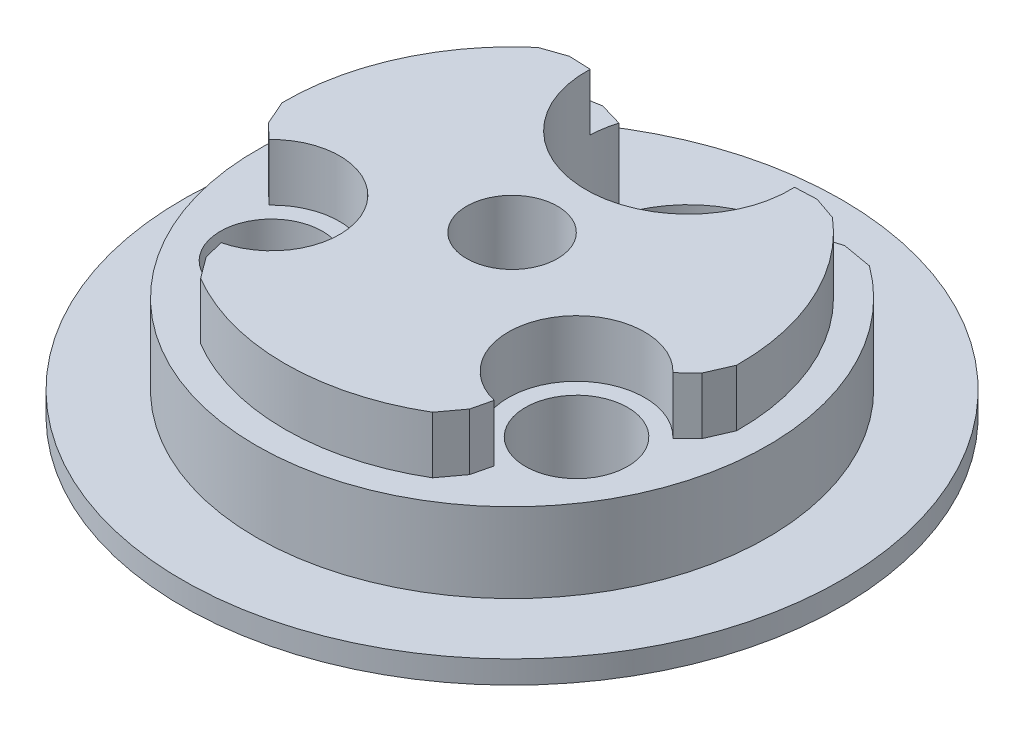
ISO-10303-21;
HEADER;
FILE_DESCRIPTION(('STEP AP214'),'2;1');
FILE_NAME('part.step','',(''),(''),'','','');
FILE_SCHEMA(('AUTOMOTIVE_DESIGN { 1 0 10303 214 1 1 1 1 }'));
ENDSEC;
DATA;
#1=APPLICATION_CONTEXT('core data for automotive mechanical design processes');
#2=APPLICATION_PROTOCOL_DEFINITION('international standard','automotive_design',2000,#1);
#3=PRODUCT_CONTEXT('',#1,'mechanical');
#4=PRODUCT('Part','Part','',(#3));
#5=PRODUCT_RELATED_PRODUCT_CATEGORY('part','',(#4));
#6=PRODUCT_DEFINITION_FORMATION('','',#4);
#7=PRODUCT_DEFINITION_CONTEXT('part definition',#1,'design');
#8=PRODUCT_DEFINITION('design','',#6,#7);
#9=PRODUCT_DEFINITION_SHAPE('','',#8);
#10=(LENGTH_UNIT() NAMED_UNIT(*) SI_UNIT(.MILLI.,.METRE.));
#11=(NAMED_UNIT(*) PLANE_ANGLE_UNIT() SI_UNIT($,.RADIAN.));
#12=(NAMED_UNIT(*) SI_UNIT($,.STERADIAN.) SOLID_ANGLE_UNIT());
#13=UNCERTAINTY_MEASURE_WITH_UNIT(LENGTH_MEASURE(1.E-05),#10,'distance_accuracy_value','');
#14=(GEOMETRIC_REPRESENTATION_CONTEXT(3) GLOBAL_UNCERTAINTY_ASSIGNED_CONTEXT((#13)) GLOBAL_UNIT_ASSIGNED_CONTEXT((#10,
#11,#12)) REPRESENTATION_CONTEXT('',''));
#15=CARTESIAN_POINT('',(0.,0.,0.));
#16=DIRECTION('',(0.,0.,1.));
#17=DIRECTION('',(1.,0.,0.));
#18=AXIS2_PLACEMENT_3D('',#15,#16,#17);
#19=CARTESIAN_POINT('',(0.,0.,0.));
#20=DIRECTION('',(0.,-1.,0.));
#21=DIRECTION('',(0.,0.,-1.));
#22=AXIS2_PLACEMENT_3D('',#19,#20,#21);
#23=PLANE('',#22);
#24=CARTESIAN_POINT('',(0.,0.,0.));
#25=DIRECTION('',(0.,-1.,0.));
#26=DIRECTION('',(0.,0.,-1.));
#27=AXIS2_PLACEMENT_3D('',#24,#25,#26);
#28=CIRCLE('',#27,29.);
#29=CARTESIAN_POINT('',(0.,0.,-29.));
#30=VERTEX_POINT('',#29);
#31=EDGE_CURVE('E273',#30,#30,#28,.T.);
#32=ORIENTED_EDGE('',*,*,#31,.F.);
#33=EDGE_LOOP('',(#32));
#34=FACE_BOUND('',#33,.T.);
#35=CARTESIAN_POINT('',(0.,0.,0.));
#36=DIRECTION('',(0.,1.,0.));
#37=DIRECTION('',(0.,0.,1.));
#38=AXIS2_PLACEMENT_3D('',#35,#36,#37);
#39=CIRCLE('',#38,19.9999999999998);
#40=CARTESIAN_POINT('',(8.64235318321493,0.,-18.0363447365747));
#41=VERTEX_POINT('',#40);
#42=CARTESIAN_POINT('',(8.63404662868261,0.,-18.0403225806449));
#43=VERTEX_POINT('',#42);
#44=EDGE_CURVE('E506',#41,#43,#39,.T.);
#45=ORIENTED_EDGE('',*,*,#44,.F.);
#46=DIRECTION('',(0.95953135461399,0.,-0.281601810208391));
#47=VECTOR('',#46,1.);
#48=CARTESIAN_POINT('',(-4.18818937937064,0.,-14.270856517554));
#49=LINE('',#48,#47);
#50=CARTESIAN_POINT('',(10.6547446660282,0.,-18.6269383442595));
#51=VERTEX_POINT('',#50);
#52=EDGE_CURVE('E248',#41,#51,#49,.T.);
#53=ORIENTED_EDGE('',*,*,#52,.T.);
#54=DIRECTION('',(0.985137296745421,0.,0.171768758978821));
#55=VECTOR('',#54,1.);
#56=CARTESIAN_POINT('',(3.46633546014796,0.,-19.8803109781098));
#57=LINE('',#56,#55);
#58=CARTESIAN_POINT('',(13.2687116499846,0.,-18.1711664774048));
#59=VERTEX_POINT('',#58);
#60=EDGE_CURVE('E63',#51,#59,#57,.T.);
#61=ORIENTED_EDGE('',*,*,#60,.T.);
#62=CARTESIAN_POINT('',(0.,0.,0.));
#63=DIRECTION('',(0.,1.,0.));
#64=DIRECTION('',(0.,0.,1.));
#65=AXIS2_PLACEMENT_3D('',#62,#63,#64);
#66=CIRCLE('',#65,22.5);
#67=CARTESIAN_POINT('',(-13.2687116499827,0.,-18.1711664774063));
#68=VERTEX_POINT('',#67);
#69=EDGE_CURVE('E359',#68,#59,#66,.T.);
#70=ORIENTED_EDGE('',*,*,#69,.F.);
#71=DIRECTION('',(0.985137296745443,0.,-0.171768758978695));
#72=VECTOR('',#71,1.);
#73=CARTESIAN_POINT('',(-3.46633546014538,0.,-19.88031097811));
#74=LINE('',#73,#72);
#75=CARTESIAN_POINT('',(-10.6547446660261,0.,-18.6269383442606));
#76=VERTEX_POINT('',#75);
#77=EDGE_CURVE('E422',#68,#76,#74,.T.);
#78=ORIENTED_EDGE('',*,*,#77,.T.);
#79=DIRECTION('',(-0.959531354613947,0.,-0.281601810208534));
#80=VECTOR('',#79,1.);
#81=CARTESIAN_POINT('',(4.18818937937259,0.,-14.2708565175528));
#82=LINE('',#81,#80);
#83=CARTESIAN_POINT('',(-8.64235318321327,0.,-18.0363447365756));
#84=VERTEX_POINT('',#83);
#85=EDGE_CURVE('E259',#84,#76,#82,.T.);
#86=ORIENTED_EDGE('',*,*,#85,.F.);
#87=CARTESIAN_POINT('',(0.,0.,0.));
#88=DIRECTION('',(0.,1.,0.));
#89=DIRECTION('',(0.,0.,1.));
#90=AXIS2_PLACEMENT_3D('',#87,#88,#89);
#91=CIRCLE('',#90,19.9999999999999);
#92=CARTESIAN_POINT('',(-8.63404662868261,0.,-18.0403225806449));
#93=VERTEX_POINT('',#92);
#94=EDGE_CURVE('E497',#93,#84,#91,.T.);
#95=ORIENTED_EDGE('',*,*,#94,.F.);
#96=CARTESIAN_POINT('',(0.,0.,-15.5));
#97=DIRECTION('',(0.,-1.,0.));
#98=DIRECTION('',(0.,0.,-1.));
#99=AXIS2_PLACEMENT_3D('',#96,#97,#98);
#100=CIRCLE('',#99,9.);
#101=EDGE_CURVE('E268',#93,#43,#100,.T.);
#102=ORIENTED_EDGE('',*,*,#101,.T.);
#103=EDGE_LOOP('',(#45,#53,#61,#70,#78,#86,#95,#102));
#104=FACE_BOUND('',#103,.T.);
#105=ADVANCED_FACE('F40',(#34,#104),#23,.F.);
#106=CARTESIAN_POINT('',(0.,7.,0.));
#107=DIRECTION('',(0.,-1.,0.));
#108=DIRECTION('',(0.,0.,-1.));
#109=AXIS2_PLACEMENT_3D('',#106,#107,#108);
#110=CYLINDRICAL_SURFACE('',#109,22.5);
#111=CARTESIAN_POINT('',(0.,7.,0.));
#112=DIRECTION('',(0.,1.,0.));
#113=DIRECTION('',(0.,0.,1.));
#114=AXIS2_PLACEMENT_3D('',#111,#112,#113);
#115=CIRCLE('',#114,22.5);
#116=CARTESIAN_POINT('',(-13.2687116499827,7.,-18.1711664774063));
#117=VERTEX_POINT('',#116);
#118=CARTESIAN_POINT('',(13.2687116499846,7.,-18.1711664774048));
#119=VERTEX_POINT('',#118);
#120=EDGE_CURVE('E360',#117,#119,#115,.T.);
#121=ORIENTED_EDGE('',*,*,#120,.F.);
#122=DIRECTION('',(0.,-1.,0.));
#123=VECTOR('',#122,1.);
#124=CARTESIAN_POINT('',(-13.2687116499827,7.,-18.1711664774063));
#125=LINE('',#124,#123);
#126=EDGE_CURVE('E401',#117,#68,#125,.T.);
#127=ORIENTED_EDGE('',*,*,#126,.T.);
#128=ORIENTED_EDGE('',*,*,#69,.T.);
#129=DIRECTION('',(0.,-1.,0.));
#130=VECTOR('',#129,1.);
#131=CARTESIAN_POINT('',(13.2687116499846,7.,-18.1711664774048));
#132=LINE('',#131,#130);
#133=EDGE_CURVE('E398',#59,#119,#132,.F.);
#134=ORIENTED_EDGE('',*,*,#133,.T.);
#135=EDGE_LOOP('',(#121,#127,#128,#134));
#136=FACE_BOUND('',#135,.T.);
#137=ADVANCED_FACE('F542',(#136),#110,.T.);
#138=CARTESIAN_POINT('',(0.,7.,0.));
#139=DIRECTION('',(0.,1.,0.));
#140=DIRECTION('',(0.,0.,1.));
#141=AXIS2_PLACEMENT_3D('',#138,#139,#140);
#142=PLANE('',#141);
#143=DIRECTION('',(-0.959531354613947,0.,-0.281601810208534));
#144=VECTOR('',#143,1.);
#145=CARTESIAN_POINT('',(4.18818937937259,7.,-14.2708565175528));
#146=LINE('',#145,#144);
#147=CARTESIAN_POINT('',(-8.64235318321327,7.,-18.0363447365756));
#148=VERTEX_POINT('',#147);
#149=CARTESIAN_POINT('',(-10.6547446660261,7.,-18.6269383442606));
#150=VERTEX_POINT('',#149);
#151=EDGE_CURVE('E247',#148,#150,#146,.T.);
#152=ORIENTED_EDGE('',*,*,#151,.T.);
#153=DIRECTION('',(-0.985137296745443,0.,0.171768758978695));
#154=VECTOR('',#153,1.);
#155=CARTESIAN_POINT('',(-3.46633546014538,7.,-19.88031097811));
#156=LINE('',#155,#154);
#157=EDGE_CURVE('E396',#150,#117,#156,.T.);
#158=ORIENTED_EDGE('',*,*,#157,.T.);
#159=ORIENTED_EDGE('',*,*,#120,.T.);
#160=DIRECTION('',(-0.985137296745421,0.,-0.171768758978821));
#161=VECTOR('',#160,1.);
#162=CARTESIAN_POINT('',(3.46633546014796,7.,-19.8803109781098));
#163=LINE('',#162,#161);
#164=CARTESIAN_POINT('',(10.6547446660282,7.,-18.6269383442595));
#165=VERTEX_POINT('',#164);
#166=EDGE_CURVE('E394',#119,#165,#163,.T.);
#167=ORIENTED_EDGE('',*,*,#166,.T.);
#168=DIRECTION('',(0.95953135461399,0.,-0.281601810208391));
#169=VECTOR('',#168,1.);
#170=CARTESIAN_POINT('',(-4.18818937937064,7.,-14.270856517554));
#171=LINE('',#170,#169);
#172=CARTESIAN_POINT('',(8.64235318321488,7.,-18.0363447365747));
#173=VERTEX_POINT('',#172);
#174=EDGE_CURVE('E250',#173,#165,#171,.T.);
#175=ORIENTED_EDGE('',*,*,#174,.F.);
#176=CARTESIAN_POINT('',(0.,7.,0.));
#177=DIRECTION('',(0.,1.,0.));
#178=DIRECTION('',(0.,0.,1.));
#179=AXIS2_PLACEMENT_3D('',#176,#177,#178);
#180=CIRCLE('',#179,19.9999999999998);
#181=CARTESIAN_POINT('',(8.63404662868261,7.,-18.0403225806449));
#182=VERTEX_POINT('',#181);
#183=EDGE_CURVE('E224',#173,#182,#180,.T.);
#184=ORIENTED_EDGE('',*,*,#183,.T.);
#185=CARTESIAN_POINT('',(0.,7.,-15.5));
#186=DIRECTION('',(0.,1.,0.));
#187=DIRECTION('',(0.,0.,1.));
#188=AXIS2_PLACEMENT_3D('',#185,#186,#187);
#189=CIRCLE('',#188,9.);
#190=CARTESIAN_POINT('',(8.99249171354196,7.,-15.8675496998764));
#191=VERTEX_POINT('',#190);
#192=EDGE_CURVE('E216',#182,#191,#189,.F.);
#193=ORIENTED_EDGE('',*,*,#192,.T.);
#194=DIRECTION('',(0.999165745949107,0.,-0.0408388555418192));
#195=VECTOR('',#194,1.);
#196=CARTESIAN_POINT('',(8.99249171354196,7.,-15.8675496998764));
#197=LINE('',#196,#195);
#198=CARTESIAN_POINT('',(10.8936338094093,7.,-15.9452549932497));
#199=VERTEX_POINT('',#198);
#200=EDGE_CURVE('E221',#191,#199,#197,.T.);
#201=ORIENTED_EDGE('',*,*,#200,.T.);
#202=DIRECTION('',(-0.945373300215917,0.,-0.325989759407969));
#203=VECTOR('',#202,1.);
#204=CARTESIAN_POINT('',(12.9601769129819,7.,-15.2326561828264));
#205=LINE('',#204,#203);
#206=CARTESIAN_POINT('',(12.9601769129819,7.,-15.2326561828264));
#207=VERTEX_POINT('',#206);
#208=EDGE_CURVE('E425',#199,#207,#205,.F.);
#209=ORIENTED_EDGE('',*,*,#208,.T.);
#210=CARTESIAN_POINT('',(0.,7.,0.));
#211=DIRECTION('',(0.,1.,0.));
#212=DIRECTION('',(0.,0.,1.));
#213=AXIS2_PLACEMENT_3D('',#210,#211,#212);
#214=CIRCLE('',#213,19.9999999999997);
#215=CARTESIAN_POINT('',(19.9985938654754,7.,0.237156918005799));
#216=VERTEX_POINT('',#215);
#217=EDGE_CURVE('E350',#216,#207,#214,.T.);
#218=ORIENTED_EDGE('',*,*,#217,.F.);
#219=DIRECTION('',(0.399344716269985,0.,-0.91680084946909));
#220=VECTOR('',#219,1.);
#221=CARTESIAN_POINT('',(19.0678522615133,7.,2.37391911463342));
#222=LINE('',#221,#220);
#223=CARTESIAN_POINT('',(19.0678522615133,7.,2.37391911463342));
#224=VERTEX_POINT('',#223);
#225=EDGE_CURVE('E418',#216,#224,#222,.F.);
#226=ORIENTED_EDGE('',*,*,#225,.T.);
#227=DIRECTION('',(0.724111911442842,0.,-0.689682491953068));
#228=VECTOR('',#227,1.);
#229=CARTESIAN_POINT('',(10.2554041460994,7.,10.7673609022921));
#230=LINE('',#229,#228);
#231=CARTESIAN_POINT('',(17.7680652273165,7.,3.61190504828133));
#232=VERTEX_POINT('',#231);
#233=EDGE_CURVE('E319',#232,#224,#230,.T.);
#234=ORIENTED_EDGE('',*,*,#233,.F.);
#235=CARTESIAN_POINT('',(13.4233937586587,7.,7.74999999999898));
#236=DIRECTION('',(0.,1.,0.));
#237=DIRECTION('',(0.,0.,1.));
#238=AXIS2_PLACEMENT_3D('',#235,#236,#237);
#239=CIRCLE('',#238,6.);
#240=CARTESIAN_POINT('',(12.012034141529,7.,13.5816433388131));
#241=VERTEX_POINT('',#240);
#242=EDGE_CURVE('E306',#232,#241,#239,.T.);
#243=ORIENTED_EDGE('',*,*,#242,.T.);
#244=DIRECTION('',(0.23522660285514,0.,-0.97194055646898));
#245=VECTOR('',#244,1.);
#246=CARTESIAN_POINT('',(14.4525101461505,7.,3.49776006544996));
#247=LINE('',#246,#245);
#248=CARTESIAN_POINT('',(11.5898003905609,7.,15.3262848967609));
#249=VERTEX_POINT('',#248);
#250=EDGE_CURVE('E317',#249,#241,#247,.T.);
#251=ORIENTED_EDGE('',*,*,#250,.F.);
#252=DIRECTION('',(0.594300467716276,0.,-0.804243093891527));
#253=VECTOR('',#252,1.);
#254=CARTESIAN_POINT('',(10.2046808484164,7.,17.2007118684652));
#255=LINE('',#254,#253);
#256=CARTESIAN_POINT('',(10.2046808484164,7.,17.2007118684652));
#257=VERTEX_POINT('',#256);
#258=EDGE_CURVE('E420',#249,#257,#255,.F.);
#259=ORIENTED_EDGE('',*,*,#258,.T.);
#260=CARTESIAN_POINT('',(0.,7.,0.));
#261=DIRECTION('',(0.,1.,0.));
#262=DIRECTION('',(0.,0.,1.));
#263=AXIS2_PLACEMENT_3D('',#260,#261,#262);
#264=CIRCLE('',#263,19.9999999999999);
#265=CARTESIAN_POINT('',(-10.2046808484139,7.,17.2007118684667));
#266=VERTEX_POINT('',#265);
#267=EDGE_CURVE('E356',#266,#257,#264,.T.);
#268=ORIENTED_EDGE('',*,*,#267,.F.);
#269=DIRECTION('',(0.59430046771634,0.,0.80424309389148));
#270=VECTOR('',#269,1.);
#271=CARTESIAN_POINT('',(-11.5898003905587,7.,15.3262848967622));
#272=LINE('',#271,#270);
#273=CARTESIAN_POINT('',(-11.5898003905587,7.,15.3262848967622));
#274=VERTEX_POINT('',#273);
#275=EDGE_CURVE('E13',#266,#274,#272,.F.);
#276=ORIENTED_EDGE('',*,*,#275,.T.);
#277=DIRECTION('',(0.235226602855154,0.,0.971940556468977));
#278=VECTOR('',#277,1.);
#279=CARTESIAN_POINT('',(-14.4525101461489,7.,3.4977600654498));
#280=LINE('',#279,#278);
#281=CARTESIAN_POINT('',(-12.0120341415269,7.,13.5816433388144));
#282=VERTEX_POINT('',#281);
#283=EDGE_CURVE('E327',#282,#274,#280,.T.);
#284=ORIENTED_EDGE('',*,*,#283,.F.);
#285=CARTESIAN_POINT('',(-13.4233937586578,7.,7.75000000000058));
#286=DIRECTION('',(0.,1.,0.));
#287=DIRECTION('',(0.,0.,1.));
#288=AXIS2_PLACEMENT_3D('',#285,#286,#287);
#289=CIRCLE('',#288,6.);
#290=CARTESIAN_POINT('',(-17.768065227316,7.,3.61190504828334));
#291=VERTEX_POINT('',#290);
#292=EDGE_CURVE('E293',#282,#291,#289,.T.);
#293=ORIENTED_EDGE('',*,*,#292,.T.);
#294=DIRECTION('',(0.724111911443029,0.,0.689682491952872));
#295=VECTOR('',#294,1.);
#296=CARTESIAN_POINT('',(-10.2554041460953,7.,10.7673609022937));
#297=LINE('',#296,#295);
#298=CARTESIAN_POINT('',(-19.0678522615129,7.,2.37391911463603));
#299=VERTEX_POINT('',#298);
#300=EDGE_CURVE('E325',#299,#291,#297,.T.);
#301=ORIENTED_EDGE('',*,*,#300,.F.);
#302=DIRECTION('',(0.399344716270161,0.,0.916800849469013));
#303=VECTOR('',#302,1.);
#304=CARTESIAN_POINT('',(-19.9985938654756,7.,0.237156918008205));
#305=LINE('',#304,#303);
#306=CARTESIAN_POINT('',(-19.9985938654756,7.,0.237156918008197));
#307=VERTEX_POINT('',#306);
#308=EDGE_CURVE('E49',#299,#307,#305,.F.);
#309=ORIENTED_EDGE('',*,*,#308,.T.);
#310=CARTESIAN_POINT('',(0.,7.,0.));
#311=DIRECTION('',(0.,1.,0.));
#312=DIRECTION('',(0.,0.,1.));
#313=AXIS2_PLACEMENT_3D('',#310,#311,#312);
#314=CIRCLE('',#313,19.9999999999999);
#315=CARTESIAN_POINT('',(-12.96017691298,7.,-15.2326561828283));
#316=VERTEX_POINT('',#315);
#317=EDGE_CURVE('E353',#316,#307,#314,.T.);
#318=ORIENTED_EDGE('',*,*,#317,.F.);
#319=DIRECTION('',(-0.945373300215965,0.,0.32598975940783));
#320=VECTOR('',#319,1.);
#321=CARTESIAN_POINT('',(-10.8936338094071,7.,-15.9452549932514));
#322=LINE('',#321,#320);
#323=CARTESIAN_POINT('',(-10.8936338094071,7.,-15.9452549932514));
#324=VERTEX_POINT('',#323);
#325=EDGE_CURVE('E427',#316,#324,#322,.F.);
#326=ORIENTED_EDGE('',*,*,#325,.T.);
#327=DIRECTION('',(0.9991657459491,0.,0.0408388555419765));
#328=VECTOR('',#327,1.);
#329=CARTESIAN_POINT('',(-12.0120341415269,7.,-15.9909673185454));
#330=LINE('',#329,#328);
#331=CARTESIAN_POINT('',(-8.9924917135419,7.,-15.8675496998778));
#332=VERTEX_POINT('',#331);
#333=EDGE_CURVE('E262',#324,#332,#330,.T.);
#334=ORIENTED_EDGE('',*,*,#333,.T.);
#335=CARTESIAN_POINT('',(0.,7.,-15.5));
#336=DIRECTION('',(0.,1.,0.));
#337=DIRECTION('',(0.,0.,1.));
#338=AXIS2_PLACEMENT_3D('',#335,#336,#337);
#339=CIRCLE('',#338,9.);
#340=CARTESIAN_POINT('',(-8.63404662868261,7.,-18.0403225806449));
#341=VERTEX_POINT('',#340);
#342=EDGE_CURVE('E498',#332,#341,#339,.F.);
#343=ORIENTED_EDGE('',*,*,#342,.T.);
#344=CARTESIAN_POINT('',(0.,7.,0.));
#345=DIRECTION('',(0.,1.,0.));
#346=DIRECTION('',(0.,0.,1.));
#347=AXIS2_PLACEMENT_3D('',#344,#345,#346);
#348=CIRCLE('',#347,19.9999999999999);
#349=EDGE_CURVE('E501',#341,#148,#348,.T.);
#350=ORIENTED_EDGE('',*,*,#349,.T.);
#351=EDGE_LOOP('',(#152,#158,#159,#167,#175,#184,#193,#201,#209,#218,#226,#234,#243,#251,#259,
#268,#276,#284,#293,#301,#309,#318,#326,#334,#343,#350));
#352=FACE_BOUND('',#351,.T.);
#353=CARTESIAN_POINT('',(-13.4233937586578,7.,7.75000000000058));
#354=DIRECTION('',(0.,-1.,0.));
#355=DIRECTION('',(0.,0.,-1.));
#356=AXIS2_PLACEMENT_3D('',#353,#354,#355);
#357=CIRCLE('',#356,4.49999999999959);
#358=CARTESIAN_POINT('',(-13.4233937586578,7.,3.25000000000099));
#359=VERTEX_POINT('',#358);
#360=EDGE_CURVE('E322',#359,#359,#357,.T.);
#361=ORIENTED_EDGE('',*,*,#360,.T.);
#362=EDGE_LOOP('',(#361));
#363=FACE_BOUND('',#362,.T.);
#364=CARTESIAN_POINT('',(13.4233937586598,7.,7.74999999999944));
#365=DIRECTION('',(0.,-1.,0.));
#366=DIRECTION('',(0.,0.,-1.));
#367=AXIS2_PLACEMENT_3D('',#364,#365,#366);
#368=CIRCLE('',#367,4.49999999999885);
#369=CARTESIAN_POINT('',(13.4233937586598,7.,3.25000000000058));
#370=VERTEX_POINT('',#369);
#371=EDGE_CURVE('E304',#370,#370,#368,.T.);
#372=ORIENTED_EDGE('',*,*,#371,.T.);
#373=EDGE_LOOP('',(#372));
#374=FACE_BOUND('',#373,.T.);
#375=ADVANCED_FACE('F219',(#352,#363,#374),#142,.T.);
#376=CARTESIAN_POINT('',(13.4233937586587,0.,7.74999999999898));
#377=DIRECTION('',(0.,1.,0.));
#378=DIRECTION('',(0.,0.,1.));
#379=AXIS2_PLACEMENT_3D('',#376,#377,#378);
#380=CYLINDRICAL_SURFACE('',#379,4.5);
#381=ORIENTED_EDGE('',*,*,#371,.F.);
#382=EDGE_LOOP('',(#381));
#383=FACE_BOUND('',#382,.T.);
#384=CARTESIAN_POINT('',(13.4233937586587,-2.,7.74999999999898));
#385=DIRECTION('',(0.,-1.,0.));
#386=DIRECTION('',(0.,0.,-1.));
#387=AXIS2_PLACEMENT_3D('',#384,#385,#386);
#388=CIRCLE('',#387,4.5);
#389=CARTESIAN_POINT('',(13.4233937586587,-2.,3.24999999999898));
#390=VERTEX_POINT('',#389);
#391=EDGE_CURVE('E279',#390,#390,#388,.F.);
#392=ORIENTED_EDGE('',*,*,#391,.F.);
#393=EDGE_LOOP('',(#392));
#394=FACE_BOUND('',#393,.T.);
#395=ADVANCED_FACE('F569',(#383,#394),#380,.F.);
#396=CARTESIAN_POINT('',(-13.4233937586578,0.,7.75000000000058));
#397=DIRECTION('',(0.,1.,0.));
#398=DIRECTION('',(0.,0.,1.));
#399=AXIS2_PLACEMENT_3D('',#396,#397,#398);
#400=CYLINDRICAL_SURFACE('',#399,4.5);
#401=ORIENTED_EDGE('',*,*,#360,.F.);
#402=EDGE_LOOP('',(#401));
#403=FACE_BOUND('',#402,.T.);
#404=CARTESIAN_POINT('',(-13.4233937586578,-2.,7.75000000000058));
#405=DIRECTION('',(0.,-1.,0.));
#406=DIRECTION('',(0.,0.,-1.));
#407=AXIS2_PLACEMENT_3D('',#404,#405,#406);
#408=CIRCLE('',#407,4.5);
#409=CARTESIAN_POINT('',(-13.4233937586578,-2.,3.25000000000058));
#410=VERTEX_POINT('',#409);
#411=EDGE_CURVE('E276',#410,#410,#408,.F.);
#412=ORIENTED_EDGE('',*,*,#411,.F.);
#413=EDGE_LOOP('',(#412));
#414=FACE_BOUND('',#413,.T.);
#415=ADVANCED_FACE('F572',(#403,#414),#400,.F.);
#416=CARTESIAN_POINT('',(10.2554041460994,0.,10.7673609022921));
#417=DIRECTION('',(0.689682491953068,0.,0.724111911442842));
#418=DIRECTION('',(0.724111911442842,0.,-0.689682491953068));
#419=AXIS2_PLACEMENT_3D('',#416,#417,#418);
#420=PLANE('',#419);
#421=ORIENTED_EDGE('',*,*,#233,.T.);
#422=DIRECTION('',(0.,1.,0.));
#423=VECTOR('',#422,1.);
#424=CARTESIAN_POINT('',(19.0678522615133,0.,2.37391911463342));
#425=LINE('',#424,#423);
#426=CARTESIAN_POINT('',(19.0678522615133,12.,2.37391911463342));
#427=VERTEX_POINT('',#426);
#428=EDGE_CURVE('E363',#224,#427,#425,.T.);
#429=ORIENTED_EDGE('',*,*,#428,.T.);
#430=DIRECTION('',(0.724111911442842,0.,-0.689682491953068));
#431=VECTOR('',#430,1.);
#432=CARTESIAN_POINT('',(10.2554041460994,12.,10.7673609022921));
#433=LINE('',#432,#431);
#434=CARTESIAN_POINT('',(17.7680652273165,12.,3.61190504828133));
#435=VERTEX_POINT('',#434);
#436=EDGE_CURVE('E330',#435,#427,#433,.T.);
#437=ORIENTED_EDGE('',*,*,#436,.F.);
#438=DIRECTION('',(0.,1.,0.));
#439=VECTOR('',#438,1.);
#440=CARTESIAN_POINT('',(17.7680652273165,7.,3.61190504828133));
#441=LINE('',#440,#439);
#442=EDGE_CURVE('E309',#232,#435,#441,.T.);
#443=ORIENTED_EDGE('',*,*,#442,.F.);
#444=EDGE_LOOP('',(#421,#429,#437,#443));
#445=FACE_BOUND('',#444,.T.);
#446=ADVANCED_FACE('F482',(#445),#420,.T.);
#447=CARTESIAN_POINT('',(14.4525101461505,0.,3.49776006544996));
#448=DIRECTION('',(0.97194055646898,0.,0.23522660285514));
#449=DIRECTION('',(0.23522660285514,0.,-0.97194055646898));
#450=AXIS2_PLACEMENT_3D('',#447,#448,#449);
#451=PLANE('',#450);
#452=DIRECTION('',(0.23522660285514,0.,-0.97194055646898));
#453=VECTOR('',#452,1.);
#454=CARTESIAN_POINT('',(14.4525101461505,12.,3.49776006544996));
#455=LINE('',#454,#453);
#456=CARTESIAN_POINT('',(11.5898003905609,12.,15.3262848967609));
#457=VERTEX_POINT('',#456);
#458=CARTESIAN_POINT('',(12.012034141529,12.,13.5816433388131));
#459=VERTEX_POINT('',#458);
#460=EDGE_CURVE('E348',#457,#459,#455,.T.);
#461=ORIENTED_EDGE('',*,*,#460,.F.);
#462=DIRECTION('',(0.,-1.,0.));
#463=VECTOR('',#462,1.);
#464=CARTESIAN_POINT('',(11.5898003905609,0.,15.3262848967609));
#465=LINE('',#464,#463);
#466=EDGE_CURVE('E389',#457,#249,#465,.T.);
#467=ORIENTED_EDGE('',*,*,#466,.T.);
#468=ORIENTED_EDGE('',*,*,#250,.T.);
#469=DIRECTION('',(0.,1.,0.));
#470=VECTOR('',#469,1.);
#471=CARTESIAN_POINT('',(12.012034141529,7.,13.5816433388131));
#472=LINE('',#471,#470);
#473=EDGE_CURVE('E300',#241,#459,#472,.T.);
#474=ORIENTED_EDGE('',*,*,#473,.T.);
#475=EDGE_LOOP('',(#461,#467,#468,#474));
#476=FACE_BOUND('',#475,.T.);
#477=ADVANCED_FACE('F471',(#476),#451,.T.);
#478=CARTESIAN_POINT('',(-14.4525101461489,0.,3.4977600654498));
#479=DIRECTION('',(-0.971940556468976,0.,0.235226602855154));
#480=DIRECTION('',(0.235226602855154,0.,0.971940556468977));
#481=AXIS2_PLACEMENT_3D('',#478,#479,#480);
#482=PLANE('',#481);
#483=ORIENTED_EDGE('',*,*,#283,.T.);
#484=DIRECTION('',(0.,1.,0.));
#485=VECTOR('',#484,1.);
#486=CARTESIAN_POINT('',(-11.5898003905587,0.,15.3262848967622));
#487=LINE('',#486,#485);
#488=CARTESIAN_POINT('',(-11.5898003905587,12.,15.3262848967622));
#489=VERTEX_POINT('',#488);
#490=EDGE_CURVE('E415',#274,#489,#487,.T.);
#491=ORIENTED_EDGE('',*,*,#490,.T.);
#492=DIRECTION('',(0.235226602855154,0.,0.971940556468977));
#493=VECTOR('',#492,1.);
#494=CARTESIAN_POINT('',(-14.4525101461489,12.,3.4977600654498));
#495=LINE('',#494,#493);
#496=CARTESIAN_POINT('',(-12.0120341415269,12.,13.5816433388144));
#497=VERTEX_POINT('',#496);
#498=EDGE_CURVE('E342',#497,#489,#495,.T.);
#499=ORIENTED_EDGE('',*,*,#498,.F.);
#500=DIRECTION('',(0.,1.,0.));
#501=VECTOR('',#500,1.);
#502=CARTESIAN_POINT('',(-12.0120341415269,7.,13.5816433388144));
#503=LINE('',#502,#501);
#504=EDGE_CURVE('E296',#282,#497,#503,.T.);
#505=ORIENTED_EDGE('',*,*,#504,.F.);
#506=EDGE_LOOP('',(#483,#491,#499,#505));
#507=FACE_BOUND('',#506,.T.);
#508=ADVANCED_FACE('F456',(#507),#482,.T.);
#509=CARTESIAN_POINT('',(-10.2554041460953,0.,10.7673609022937));
#510=DIRECTION('',(-0.689682491952872,0.,0.724111911443029));
#511=DIRECTION('',(0.724111911443029,0.,0.689682491952872));
#512=AXIS2_PLACEMENT_3D('',#509,#510,#511);
#513=PLANE('',#512);
#514=DIRECTION('',(0.724111911443029,0.,0.689682491952872));
#515=VECTOR('',#514,1.);
#516=CARTESIAN_POINT('',(-10.2554041460953,12.,10.7673609022937));
#517=LINE('',#516,#515);
#518=CARTESIAN_POINT('',(-19.0678522615129,12.,2.37391911463603));
#519=VERTEX_POINT('',#518);
#520=CARTESIAN_POINT('',(-17.768065227316,12.,3.61190504828334));
#521=VERTEX_POINT('',#520);
#522=EDGE_CURVE('E340',#519,#521,#517,.T.);
#523=ORIENTED_EDGE('',*,*,#522,.F.);
#524=DIRECTION('',(0.,-1.,0.));
#525=VECTOR('',#524,1.);
#526=CARTESIAN_POINT('',(-19.0678522615129,0.,2.37391911463603));
#527=LINE('',#526,#525);
#528=EDGE_CURVE('E413',#519,#299,#527,.T.);
#529=ORIENTED_EDGE('',*,*,#528,.T.);
#530=ORIENTED_EDGE('',*,*,#300,.T.);
#531=DIRECTION('',(0.,1.,0.));
#532=VECTOR('',#531,1.);
#533=CARTESIAN_POINT('',(-17.768065227316,7.,3.61190504828334));
#534=LINE('',#533,#532);
#535=EDGE_CURVE('E301',#291,#521,#534,.T.);
#536=ORIENTED_EDGE('',*,*,#535,.T.);
#537=EDGE_LOOP('',(#523,#529,#530,#536));
#538=FACE_BOUND('',#537,.T.);
#539=ADVANCED_FACE('F446',(#538),#513,.T.);
#540=CARTESIAN_POINT('',(0.,7.,-15.5));
#541=DIRECTION('',(0.,-1.,0.));
#542=DIRECTION('',(0.,0.,-1.));
#543=AXIS2_PLACEMENT_3D('',#540,#541,#542);
#544=CYLINDRICAL_SURFACE('',#543,9.);
#545=ORIENTED_EDGE('',*,*,#101,.F.);
#546=DIRECTION('',(0.,-1.,0.));
#547=VECTOR('',#546,1.);
#548=CARTESIAN_POINT('',(-8.63404662868261,11.0164339442283,-18.0403225806449));
#549=LINE('',#548,#547);
#550=EDGE_CURVE('E229',#341,#93,#549,.T.);
#551=ORIENTED_EDGE('',*,*,#550,.F.);
#552=ORIENTED_EDGE('',*,*,#342,.F.);
#553=DIRECTION('',(0.,1.,0.));
#554=VECTOR('',#553,1.);
#555=CARTESIAN_POINT('',(-8.9924917135419,-7.69343938724481,-15.8675496998778));
#556=LINE('',#555,#554);
#557=CARTESIAN_POINT('',(-8.9924917135419,12.,-15.8675496998778));
#558=VERTEX_POINT('',#557);
#559=EDGE_CURVE('E263',#332,#558,#556,.T.);
#560=ORIENTED_EDGE('',*,*,#559,.T.);
#561=CARTESIAN_POINT('',(0.,12.,-15.5));
#562=DIRECTION('',(0.,1.,0.));
#563=DIRECTION('',(0.,0.,1.));
#564=AXIS2_PLACEMENT_3D('',#561,#562,#563);
#565=CIRCLE('',#564,9.);
#566=CARTESIAN_POINT('',(8.99249171354196,12.,-15.8675496998764));
#567=VERTEX_POINT('',#566);
#568=EDGE_CURVE('E246',#567,#558,#565,.F.);
#569=ORIENTED_EDGE('',*,*,#568,.F.);
#570=DIRECTION('',(0.,1.,0.));
#571=VECTOR('',#570,1.);
#572=CARTESIAN_POINT('',(8.99249171354196,-7.69343938724481,-15.8675496998764));
#573=LINE('',#572,#571);
#574=EDGE_CURVE('E234',#191,#567,#573,.T.);
#575=ORIENTED_EDGE('',*,*,#574,.F.);
#576=ORIENTED_EDGE('',*,*,#192,.F.);
#577=DIRECTION('',(0.,-1.,0.));
#578=VECTOR('',#577,1.);
#579=CARTESIAN_POINT('',(8.63404662868261,11.0164339442283,-18.0403225806449));
#580=LINE('',#579,#578);
#581=EDGE_CURVE('E238',#182,#43,#580,.T.);
#582=ORIENTED_EDGE('',*,*,#581,.T.);
#583=EDGE_LOOP('',(#545,#551,#552,#560,#569,#575,#576,#582));
#584=FACE_BOUND('',#583,.T.);
#585=CARTESIAN_POINT('',(0.,-2.,-15.5));
#586=DIRECTION('',(0.,-1.,0.));
#587=DIRECTION('',(0.,0.,-1.));
#588=AXIS2_PLACEMENT_3D('',#585,#586,#587);
#589=CIRCLE('',#588,9.);
#590=CARTESIAN_POINT('',(0.,-2.,-24.5));
#591=VERTEX_POINT('',#590);
#592=EDGE_CURVE('E269',#591,#591,#589,.T.);
#593=ORIENTED_EDGE('',*,*,#592,.T.);
#594=EDGE_LOOP('',(#593));
#595=FACE_BOUND('',#594,.T.);
#596=ADVANCED_FACE('F242',(#584,#595),#544,.F.);
#597=CARTESIAN_POINT('',(0.,0.,0.));
#598=DIRECTION('',(0.,1.,0.));
#599=DIRECTION('',(0.,0.,1.));
#600=AXIS2_PLACEMENT_3D('',#597,#598,#599);
#601=CYLINDRICAL_SURFACE('',#600,19.9999999999999);
#602=ORIENTED_EDGE('',*,*,#267,.T.);
#603=DIRECTION('',(0.,1.,0.));
#604=VECTOR('',#603,1.);
#605=CARTESIAN_POINT('',(10.2046808484164,0.,17.2007118684652));
#606=LINE('',#605,#604);
#607=CARTESIAN_POINT('',(10.2046808484164,12.,17.2007118684652));
#608=VERTEX_POINT('',#607);
#609=EDGE_CURVE('E386',#257,#608,#606,.T.);
#610=ORIENTED_EDGE('',*,*,#609,.T.);
#611=CARTESIAN_POINT('',(0.,12.,0.));
#612=DIRECTION('',(0.,1.,0.));
#613=DIRECTION('',(0.,0.,1.));
#614=AXIS2_PLACEMENT_3D('',#611,#612,#613);
#615=CIRCLE('',#614,19.9999999999999);
#616=CARTESIAN_POINT('',(-10.2046808484139,12.,17.2007118684667));
#617=VERTEX_POINT('',#616);
#618=EDGE_CURVE('E345',#617,#608,#615,.T.);
#619=ORIENTED_EDGE('',*,*,#618,.F.);
#620=DIRECTION('',(0.,1.,0.));
#621=VECTOR('',#620,1.);
#622=CARTESIAN_POINT('',(-10.2046808484139,0.,17.2007118684667));
#623=LINE('',#622,#621);
#624=EDGE_CURVE('E384',#617,#266,#623,.F.);
#625=ORIENTED_EDGE('',*,*,#624,.T.);
#626=EDGE_LOOP('',(#602,#610,#619,#625));
#627=FACE_BOUND('',#626,.T.);
#628=ADVANCED_FACE('F462',(#627),#601,.T.);
#629=CARTESIAN_POINT('',(0.,0.,0.));
#630=DIRECTION('',(0.,1.,0.));
#631=DIRECTION('',(0.,0.,1.));
#632=AXIS2_PLACEMENT_3D('',#629,#630,#631);
#633=CYLINDRICAL_SURFACE('',#632,19.9999999999999);
#634=CARTESIAN_POINT('',(0.,12.,0.));
#635=DIRECTION('',(0.,1.,0.));
#636=DIRECTION('',(0.,0.,1.));
#637=AXIS2_PLACEMENT_3D('',#634,#635,#636);
#638=CIRCLE('',#637,19.9999999999999);
#639=CARTESIAN_POINT('',(-12.96017691298,12.,-15.2326561828283));
#640=VERTEX_POINT('',#639);
#641=CARTESIAN_POINT('',(-19.9985938654756,12.,0.237156918008197));
#642=VERTEX_POINT('',#641);
#643=EDGE_CURVE('E337',#640,#642,#638,.T.);
#644=ORIENTED_EDGE('',*,*,#643,.F.);
#645=DIRECTION('',(0.,1.,0.));
#646=VECTOR('',#645,1.);
#647=CARTESIAN_POINT('',(-12.96017691298,0.,-15.2326561828283));
#648=LINE('',#647,#646);
#649=EDGE_CURVE('E411',#640,#316,#648,.F.);
#650=ORIENTED_EDGE('',*,*,#649,.T.);
#651=ORIENTED_EDGE('',*,*,#317,.T.);
#652=DIRECTION('',(0.,1.,0.));
#653=VECTOR('',#652,1.);
#654=CARTESIAN_POINT('',(-19.9985938654756,0.,0.237156918008197));
#655=LINE('',#654,#653);
#656=EDGE_CURVE('E408',#307,#642,#655,.T.);
#657=ORIENTED_EDGE('',*,*,#656,.T.);
#658=EDGE_LOOP('',(#644,#650,#651,#657));
#659=FACE_BOUND('',#658,.T.);
#660=ADVANCED_FACE('F437',(#659),#633,.T.);
#661=CARTESIAN_POINT('',(0.,0.,0.));
#662=DIRECTION('',(0.,1.,0.));
#663=DIRECTION('',(0.,0.,1.));
#664=AXIS2_PLACEMENT_3D('',#661,#662,#663);
#665=CYLINDRICAL_SURFACE('',#664,19.9999999999997);
#666=CARTESIAN_POINT('',(0.,12.,0.));
#667=DIRECTION('',(0.,1.,0.));
#668=DIRECTION('',(0.,0.,1.));
#669=AXIS2_PLACEMENT_3D('',#666,#667,#668);
#670=CIRCLE('',#669,19.9999999999997);
#671=CARTESIAN_POINT('',(19.9985938654754,12.,0.237156918005799));
#672=VERTEX_POINT('',#671);
#673=CARTESIAN_POINT('',(12.9601769129819,12.,-15.2326561828264));
#674=VERTEX_POINT('',#673);
#675=EDGE_CURVE('E333',#672,#674,#670,.T.);
#676=ORIENTED_EDGE('',*,*,#675,.F.);
#677=DIRECTION('',(0.,1.,0.));
#678=VECTOR('',#677,1.);
#679=CARTESIAN_POINT('',(19.9985938654754,0.,0.237156918005799));
#680=LINE('',#679,#678);
#681=EDGE_CURVE('E382',#672,#216,#680,.F.);
#682=ORIENTED_EDGE('',*,*,#681,.T.);
#683=ORIENTED_EDGE('',*,*,#217,.T.);
#684=DIRECTION('',(0.,1.,0.));
#685=VECTOR('',#684,1.);
#686=CARTESIAN_POINT('',(12.9601769129819,0.,-15.2326561828264));
#687=LINE('',#686,#685);
#688=EDGE_CURVE('E379',#207,#674,#687,.T.);
#689=ORIENTED_EDGE('',*,*,#688,.T.);
#690=EDGE_LOOP('',(#676,#682,#683,#689));
#691=FACE_BOUND('',#690,.T.);
#692=ADVANCED_FACE('F489',(#691),#665,.T.);
#693=CARTESIAN_POINT('',(0.,12.,0.));
#694=DIRECTION('',(0.,1.,0.));
#695=DIRECTION('',(0.,0.,1.));
#696=AXIS2_PLACEMENT_3D('',#693,#694,#695);
#697=PLANE('',#696);
#698=ORIENTED_EDGE('',*,*,#436,.T.);
#699=DIRECTION('',(-0.399344716269985,0.,0.91680084946909));
#700=VECTOR('',#699,1.);
#701=CARTESIAN_POINT('',(16.8961218522684,12.,7.35969757343109));
#702=LINE('',#701,#700);
#703=EDGE_CURVE('E377',#427,#672,#702,.F.);
#704=ORIENTED_EDGE('',*,*,#703,.T.);
#705=ORIENTED_EDGE('',*,*,#675,.T.);
#706=DIRECTION('',(0.945373300215917,0.,0.325989759407969));
#707=VECTOR('',#706,1.);
#708=CARTESIAN_POINT('',(6.07169990107321,12.,-17.6079855509041));
#709=LINE('',#708,#707);
#710=CARTESIAN_POINT('',(10.8936338094093,12.,-15.9452549932497));
#711=VERTEX_POINT('',#710);
#712=EDGE_CURVE('E373',#674,#711,#709,.F.);
#713=ORIENTED_EDGE('',*,*,#712,.T.);
#714=DIRECTION('',(0.999165745949107,0.,-0.0408388555418191));
#715=VECTOR('',#714,1.);
#716=CARTESIAN_POINT('',(-0.632474176197817,12.,-15.4741489121095));
#717=LINE('',#716,#715);
#718=EDGE_CURVE('E265',#567,#711,#717,.T.);
#719=ORIENTED_EDGE('',*,*,#718,.F.);
#720=ORIENTED_EDGE('',*,*,#568,.T.);
#721=DIRECTION('',(0.9991657459491,0.,0.0408388555419752));
#722=VECTOR('',#721,1.);
#723=CARTESIAN_POINT('',(0.632474176200231,12.,-15.4741489121093));
#724=LINE('',#723,#722);
#725=CARTESIAN_POINT('',(-10.8936338094071,12.,-15.9452549932514));
#726=VERTEX_POINT('',#725);
#727=EDGE_CURVE('E256',#726,#558,#724,.T.);
#728=ORIENTED_EDGE('',*,*,#727,.F.);
#729=DIRECTION('',(0.945373300215965,0.,-0.32598975940783));
#730=VECTOR('',#729,1.);
#731=CARTESIAN_POINT('',(-6.07169990107064,12.,-17.6079855509051));
#732=LINE('',#731,#730);
#733=EDGE_CURVE('E371',#726,#640,#732,.F.);
#734=ORIENTED_EDGE('',*,*,#733,.T.);
#735=ORIENTED_EDGE('',*,*,#643,.T.);
#736=DIRECTION('',(-0.399344716270161,0.,-0.916800849469013));
#737=VECTOR('',#736,1.);
#738=CARTESIAN_POINT('',(-16.8961218522666,12.,7.35969757343418));
#739=LINE('',#738,#737);
#740=EDGE_CURVE('E369',#642,#519,#739,.F.);
#741=ORIENTED_EDGE('',*,*,#740,.T.);
#742=ORIENTED_EDGE('',*,*,#522,.T.);
#743=CARTESIAN_POINT('',(-13.4233937586578,12.,7.75000000000058));
#744=DIRECTION('',(0.,1.,0.));
#745=DIRECTION('',(0.,0.,1.));
#746=AXIS2_PLACEMENT_3D('',#743,#744,#745);
#747=CIRCLE('',#746,6.);
#748=EDGE_CURVE('E297',#497,#521,#747,.T.);
#749=ORIENTED_EDGE('',*,*,#748,.F.);
#750=ORIENTED_EDGE('',*,*,#498,.T.);
#751=DIRECTION('',(-0.59430046771634,0.,-0.80424309389148));
#752=VECTOR('',#751,1.);
#753=CARTESIAN_POINT('',(-14.8217459888966,12.,10.9526219627851));
#754=LINE('',#753,#752);
#755=EDGE_CURVE('E367',#489,#617,#754,.F.);
#756=ORIENTED_EDGE('',*,*,#755,.T.);
#757=ORIENTED_EDGE('',*,*,#618,.T.);
#758=DIRECTION('',(-0.594300467716276,0.,0.804243093891527));
#759=VECTOR('',#758,1.);
#760=CARTESIAN_POINT('',(14.8217459888979,12.,10.9526219627842));
#761=LINE('',#760,#759);
#762=EDGE_CURVE('E375',#608,#457,#761,.F.);
#763=ORIENTED_EDGE('',*,*,#762,.T.);
#764=ORIENTED_EDGE('',*,*,#460,.T.);
#765=CARTESIAN_POINT('',(13.4233937586587,12.,7.74999999999898));
#766=DIRECTION('',(0.,1.,0.));
#767=DIRECTION('',(0.,0.,1.));
#768=AXIS2_PLACEMENT_3D('',#765,#766,#767);
#769=CIRCLE('',#768,6.);
#770=EDGE_CURVE('E292',#435,#459,#769,.T.);
#771=ORIENTED_EDGE('',*,*,#770,.F.);
#772=EDGE_LOOP('',(#698,#704,#705,#713,#719,#720,#728,#734,#735,#741,#742,#749,#750,#756,#757,
#763,#764,#771));
#773=FACE_BOUND('',#772,.T.);
#774=CARTESIAN_POINT('',(0.,12.,0.));
#775=DIRECTION('',(0.,1.,0.));
#776=DIRECTION('',(0.,0.,1.));
#777=AXIS2_PLACEMENT_3D('',#774,#775,#776);
#778=CIRCLE('',#777,4.);
#779=CARTESIAN_POINT('',(0.,12.,4.));
#780=VERTEX_POINT('',#779);
#781=EDGE_CURVE('E285',#780,#780,#778,.T.);
#782=ORIENTED_EDGE('',*,*,#781,.F.);
#783=EDGE_LOOP('',(#782));
#784=FACE_BOUND('',#783,.T.);
#785=ADVANCED_FACE('F442',(#773,#784),#697,.T.);
#786=CARTESIAN_POINT('',(13.4233937586587,7.,7.74999999999898));
#787=DIRECTION('',(0.,1.,0.));
#788=DIRECTION('',(0.,0.,1.));
#789=AXIS2_PLACEMENT_3D('',#786,#787,#788);
#790=CYLINDRICAL_SURFACE('',#789,6.);
#791=ORIENTED_EDGE('',*,*,#770,.T.);
#792=ORIENTED_EDGE('',*,*,#473,.F.);
#793=ORIENTED_EDGE('',*,*,#242,.F.);
#794=ORIENTED_EDGE('',*,*,#442,.T.);
#795=EDGE_LOOP('',(#791,#792,#793,#794));
#796=FACE_BOUND('',#795,.T.);
#797=ADVANCED_FACE('F475',(#796),#790,.F.);
#798=CARTESIAN_POINT('',(-13.4233937586578,7.,7.75000000000058));
#799=DIRECTION('',(0.,1.,0.));
#800=DIRECTION('',(0.,0.,1.));
#801=AXIS2_PLACEMENT_3D('',#798,#799,#800);
#802=CYLINDRICAL_SURFACE('',#801,6.);
#803=ORIENTED_EDGE('',*,*,#748,.T.);
#804=ORIENTED_EDGE('',*,*,#535,.F.);
#805=ORIENTED_EDGE('',*,*,#292,.F.);
#806=ORIENTED_EDGE('',*,*,#504,.T.);
#807=EDGE_LOOP('',(#803,#804,#805,#806));
#808=FACE_BOUND('',#807,.T.);
#809=ADVANCED_FACE('F449',(#808),#802,.F.);
#810=CARTESIAN_POINT('',(0.,0.,0.));
#811=DIRECTION('',(0.,1.,0.));
#812=DIRECTION('',(0.,0.,1.));
#813=AXIS2_PLACEMENT_3D('',#810,#811,#812);
#814=CYLINDRICAL_SURFACE('',#813,4.);
#815=ORIENTED_EDGE('',*,*,#781,.T.);
#816=EDGE_LOOP('',(#815));
#817=FACE_BOUND('',#816,.T.);
#818=CARTESIAN_POINT('',(0.,-2.,0.));
#819=DIRECTION('',(0.,-1.,0.));
#820=DIRECTION('',(0.,0.,-1.));
#821=AXIS2_PLACEMENT_3D('',#818,#819,#820);
#822=CIRCLE('',#821,4.);
#823=CARTESIAN_POINT('',(0.,-2.,-4.));
#824=VERTEX_POINT('',#823);
#825=EDGE_CURVE('E282',#824,#824,#822,.F.);
#826=ORIENTED_EDGE('',*,*,#825,.F.);
#827=EDGE_LOOP('',(#826));
#828=FACE_BOUND('',#827,.T.);
#829=ADVANCED_FACE('F558',(#817,#828),#814,.F.);
#830=CARTESIAN_POINT('',(0.,-2.,0.));
#831=DIRECTION('',(0.,1.,0.));
#832=DIRECTION('',(0.,0.,1.));
#833=AXIS2_PLACEMENT_3D('',#830,#831,#832);
#834=CYLINDRICAL_SURFACE('',#833,29.);
#835=CARTESIAN_POINT('',(0.,-2.,0.));
#836=DIRECTION('',(0.,-1.,0.));
#837=DIRECTION('',(0.,0.,-1.));
#838=AXIS2_PLACEMENT_3D('',#835,#836,#837);
#839=CIRCLE('',#838,29.);
#840=CARTESIAN_POINT('',(0.,-2.,-29.));
#841=VERTEX_POINT('',#840);
#842=EDGE_CURVE('E272',#841,#841,#839,.T.);
#843=ORIENTED_EDGE('',*,*,#842,.F.);
#844=EDGE_LOOP('',(#843));
#845=FACE_BOUND('',#844,.T.);
#846=ORIENTED_EDGE('',*,*,#31,.T.);
#847=EDGE_LOOP('',(#846));
#848=FACE_BOUND('',#847,.T.);
#849=ADVANCED_FACE('F555',(#845,#848),#834,.T.);
#850=CARTESIAN_POINT('',(0.,-2.,0.));
#851=DIRECTION('',(0.,-1.,0.));
#852=DIRECTION('',(0.,0.,-1.));
#853=AXIS2_PLACEMENT_3D('',#850,#851,#852);
#854=PLANE('',#853);
#855=ORIENTED_EDGE('',*,*,#592,.F.);
#856=EDGE_LOOP('',(#855));
#857=FACE_BOUND('',#856,.T.);
#858=ORIENTED_EDGE('',*,*,#842,.T.);
#859=EDGE_LOOP('',(#858));
#860=FACE_BOUND('',#859,.T.);
#861=ORIENTED_EDGE('',*,*,#411,.T.);
#862=EDGE_LOOP('',(#861));
#863=FACE_BOUND('',#862,.T.);
#864=ORIENTED_EDGE('',*,*,#391,.T.);
#865=EDGE_LOOP('',(#864));
#866=FACE_BOUND('',#865,.T.);
#867=ORIENTED_EDGE('',*,*,#825,.T.);
#868=EDGE_LOOP('',(#867));
#869=FACE_BOUND('',#868,.T.);
#870=ADVANCED_FACE('F553',(#857,#860,#863,#866,#869),#854,.T.);
#871=CARTESIAN_POINT('',(4.18818937937259,-7.69343938724481,-14.2708565175528));
#872=DIRECTION('',(0.281601810208534,0.,-0.959531354613947));
#873=DIRECTION('',(-0.959531354613947,0.,-0.281601810208534));
#874=AXIS2_PLACEMENT_3D('',#871,#872,#873);
#875=PLANE('',#874);
#876=ORIENTED_EDGE('',*,*,#85,.T.);
#877=DIRECTION('',(0.,1.,0.));
#878=VECTOR('',#877,1.);
#879=CARTESIAN_POINT('',(-10.6547446660261,7.,-18.6269383442606));
#880=LINE('',#879,#878);
#881=EDGE_CURVE('E391',#76,#150,#880,.T.);
#882=ORIENTED_EDGE('',*,*,#881,.T.);
#883=ORIENTED_EDGE('',*,*,#151,.F.);
#884=DIRECTION('',(0.,1.,0.));
#885=VECTOR('',#884,1.);
#886=CARTESIAN_POINT('',(-8.64235318321329,-7.69343938724481,-18.0363447365756));
#887=LINE('',#886,#885);
#888=EDGE_CURVE('E258',#84,#148,#887,.T.);
#889=ORIENTED_EDGE('',*,*,#888,.F.);
#890=EDGE_LOOP('',(#876,#882,#883,#889));
#891=FACE_BOUND('',#890,.T.);
#892=ADVANCED_FACE('F520',(#891),#875,.T.);
#893=CARTESIAN_POINT('',(0.632474176200231,-7.69343938724481,-15.4741489121093));
#894=DIRECTION('',(-0.0408388555419752,0.,0.9991657459491));
#895=DIRECTION('',(0.9991657459491,0.,0.0408388555419752));
#896=AXIS2_PLACEMENT_3D('',#893,#894,#895);
#897=PLANE('',#896);
#898=ORIENTED_EDGE('',*,*,#333,.F.);
#899=DIRECTION('',(0.,1.,0.));
#900=VECTOR('',#899,1.);
#901=CARTESIAN_POINT('',(-10.8936338094071,12.,-15.9452549932514));
#902=LINE('',#901,#900);
#903=EDGE_CURVE('E405',#324,#726,#902,.T.);
#904=ORIENTED_EDGE('',*,*,#903,.T.);
#905=ORIENTED_EDGE('',*,*,#727,.T.);
#906=ORIENTED_EDGE('',*,*,#559,.F.);
#907=EDGE_LOOP('',(#898,#904,#905,#906));
#908=FACE_BOUND('',#907,.T.);
#909=ADVANCED_FACE('F527',(#908),#897,.F.);
#910=CARTESIAN_POINT('',(-0.632474176197817,-7.69343938724481,-15.4741489121095));
#911=DIRECTION('',(0.0408388555418191,0.,0.999165745949106));
#912=DIRECTION('',(0.999165745949107,0.,-0.0408388555418191));
#913=AXIS2_PLACEMENT_3D('',#910,#911,#912);
#914=PLANE('',#913);
#915=ORIENTED_EDGE('',*,*,#718,.T.);
#916=DIRECTION('',(0.,-1.,0.));
#917=VECTOR('',#916,1.);
#918=CARTESIAN_POINT('',(10.8936338094093,7.,-15.9452549932497));
#919=LINE('',#918,#917);
#920=EDGE_CURVE('E237',#711,#199,#919,.T.);
#921=ORIENTED_EDGE('',*,*,#920,.T.);
#922=ORIENTED_EDGE('',*,*,#200,.F.);
#923=ORIENTED_EDGE('',*,*,#574,.T.);
#924=EDGE_LOOP('',(#915,#921,#922,#923));
#925=FACE_BOUND('',#924,.T.);
#926=ADVANCED_FACE('F233',(#925),#914,.F.);
#927=CARTESIAN_POINT('',(-4.18818937937064,-7.69343938724481,-14.270856517554));
#928=DIRECTION('',(0.281601810208391,0.,0.95953135461399));
#929=DIRECTION('',(0.95953135461399,0.,-0.281601810208391));
#930=AXIS2_PLACEMENT_3D('',#927,#928,#929);
#931=PLANE('',#930);
#932=ORIENTED_EDGE('',*,*,#174,.T.);
#933=DIRECTION('',(0.,-1.,0.));
#934=VECTOR('',#933,1.);
#935=CARTESIAN_POINT('',(10.6547446660282,-7.69343938724481,-18.6269383442595));
#936=LINE('',#935,#934);
#937=EDGE_CURVE('E56',#165,#51,#936,.T.);
#938=ORIENTED_EDGE('',*,*,#937,.T.);
#939=ORIENTED_EDGE('',*,*,#52,.F.);
#940=DIRECTION('',(0.,1.,0.));
#941=VECTOR('',#940,1.);
#942=CARTESIAN_POINT('',(8.64235318321488,-7.69343938724481,-18.0363447365747));
#943=LINE('',#942,#941);
#944=EDGE_CURVE('E252',#41,#173,#943,.T.);
#945=ORIENTED_EDGE('',*,*,#944,.T.);
#946=EDGE_LOOP('',(#932,#938,#939,#945));
#947=FACE_BOUND('',#946,.T.);
#948=ADVANCED_FACE('F631',(#947),#931,.F.);
#949=CARTESIAN_POINT('',(0.,11.0164339442283,0.));
#950=DIRECTION('',(0.,-1.,0.));
#951=DIRECTION('',(0.,0.,-1.));
#952=AXIS2_PLACEMENT_3D('',#949,#950,#951);
#953=CYLINDRICAL_SURFACE('',#952,19.9999999999999);
#954=ORIENTED_EDGE('',*,*,#888,.T.);
#955=ORIENTED_EDGE('',*,*,#349,.F.);
#956=ORIENTED_EDGE('',*,*,#550,.T.);
#957=ORIENTED_EDGE('',*,*,#94,.T.);
#958=EDGE_LOOP('',(#954,#955,#956,#957));
#959=FACE_BOUND('',#958,.T.);
#960=ADVANCED_FACE('F516',(#959),#953,.T.);
#961=CARTESIAN_POINT('',(0.,11.0164339442283,0.));
#962=DIRECTION('',(0.,-1.,0.));
#963=DIRECTION('',(0.,0.,-1.));
#964=AXIS2_PLACEMENT_3D('',#961,#962,#963);
#965=CYLINDRICAL_SURFACE('',#964,19.9999999999998);
#966=ORIENTED_EDGE('',*,*,#183,.F.);
#967=ORIENTED_EDGE('',*,*,#944,.F.);
#968=ORIENTED_EDGE('',*,*,#44,.T.);
#969=ORIENTED_EDGE('',*,*,#581,.F.);
#970=EDGE_LOOP('',(#966,#967,#968,#969));
#971=FACE_BOUND('',#970,.T.);
#972=ADVANCED_FACE('F511',(#971),#965,.T.);
#973=CARTESIAN_POINT('',(19.0678522615133,0.,2.37391911463342));
#974=DIRECTION('',(-0.91680084946909,0.,-0.399344716269985));
#975=DIRECTION('',(0.,1.,0.));
#976=AXIS2_PLACEMENT_3D('',#973,#974,#975);
#977=PLANE('',#976);
#978=ORIENTED_EDGE('',*,*,#225,.F.);
#979=ORIENTED_EDGE('',*,*,#681,.F.);
#980=ORIENTED_EDGE('',*,*,#703,.F.);
#981=ORIENTED_EDGE('',*,*,#428,.F.);
#982=EDGE_LOOP('',(#978,#979,#980,#981));
#983=FACE_BOUND('',#982,.T.);
#984=ADVANCED_FACE('F485',(#983),#977,.F.);
#985=CARTESIAN_POINT('',(10.2046808484164,0.,17.2007118684652));
#986=DIRECTION('',(-0.804243093891527,0.,-0.594300467716276));
#987=DIRECTION('',(0.,1.,0.));
#988=AXIS2_PLACEMENT_3D('',#985,#986,#987);
#989=PLANE('',#988);
#990=ORIENTED_EDGE('',*,*,#258,.F.);
#991=ORIENTED_EDGE('',*,*,#466,.F.);
#992=ORIENTED_EDGE('',*,*,#762,.F.);
#993=ORIENTED_EDGE('',*,*,#609,.F.);
#994=EDGE_LOOP('',(#990,#991,#992,#993));
#995=FACE_BOUND('',#994,.T.);
#996=ADVANCED_FACE('F466',(#995),#989,.F.);
#997=CARTESIAN_POINT('',(-10.6547446660261,7.,-18.6269383442606));
#998=DIRECTION('',(-0.171768758978695,0.,-0.985137296745443));
#999=DIRECTION('',(0.,-1.,0.));
#1000=AXIS2_PLACEMENT_3D('',#997,#998,#999);
#1001=PLANE('',#1000);
#1002=ORIENTED_EDGE('',*,*,#77,.F.);
#1003=ORIENTED_EDGE('',*,*,#126,.F.);
#1004=ORIENTED_EDGE('',*,*,#157,.F.);
#1005=ORIENTED_EDGE('',*,*,#881,.F.);
#1006=EDGE_LOOP('',(#1002,#1003,#1004,#1005));
#1007=FACE_BOUND('',#1006,.T.);
#1008=ADVANCED_FACE('F606',(#1007),#1001,.T.);
#1009=CARTESIAN_POINT('',(13.2687116499846,7.,-18.1711664774048));
#1010=DIRECTION('',(0.171768758978821,0.,-0.985137296745421));
#1011=DIRECTION('',(0.,-1.,0.));
#1012=AXIS2_PLACEMENT_3D('',#1009,#1010,#1011);
#1013=PLANE('',#1012);
#1014=ORIENTED_EDGE('',*,*,#60,.F.);
#1015=ORIENTED_EDGE('',*,*,#937,.F.);
#1016=ORIENTED_EDGE('',*,*,#166,.F.);
#1017=ORIENTED_EDGE('',*,*,#133,.F.);
#1018=EDGE_LOOP('',(#1014,#1015,#1016,#1017));
#1019=FACE_BOUND('',#1018,.T.);
#1020=ADVANCED_FACE('F538',(#1019),#1013,.T.);
#1021=CARTESIAN_POINT('',(12.9601769129819,0.,-15.2326561828264));
#1022=DIRECTION('',(-0.325989759407969,0.,0.945373300215917));
#1023=DIRECTION('',(0.,1.,0.));
#1024=AXIS2_PLACEMENT_3D('',#1021,#1022,#1023);
#1025=PLANE('',#1024);
#1026=ORIENTED_EDGE('',*,*,#208,.F.);
#1027=ORIENTED_EDGE('',*,*,#920,.F.);
#1028=ORIENTED_EDGE('',*,*,#712,.F.);
#1029=ORIENTED_EDGE('',*,*,#688,.F.);
#1030=EDGE_LOOP('',(#1026,#1027,#1028,#1029));
#1031=FACE_BOUND('',#1030,.T.);
#1032=ADVANCED_FACE('F492',(#1031),#1025,.F.);
#1033=CARTESIAN_POINT('',(-10.8936338094071,0.,-15.9452549932514));
#1034=DIRECTION('',(0.32598975940783,0.,0.945373300215965));
#1035=DIRECTION('',(0.,1.,0.));
#1036=AXIS2_PLACEMENT_3D('',#1033,#1034,#1035);
#1037=PLANE('',#1036);
#1038=ORIENTED_EDGE('',*,*,#325,.F.);
#1039=ORIENTED_EDGE('',*,*,#649,.F.);
#1040=ORIENTED_EDGE('',*,*,#733,.F.);
#1041=ORIENTED_EDGE('',*,*,#903,.F.);
#1042=EDGE_LOOP('',(#1038,#1039,#1040,#1041));
#1043=FACE_BOUND('',#1042,.T.);
#1044=ADVANCED_FACE('F531',(#1043),#1037,.F.);
#1045=CARTESIAN_POINT('',(-19.9985938654756,0.,0.237156918008205));
#1046=DIRECTION('',(0.916800849469013,0.,-0.399344716270161));
#1047=DIRECTION('',(0.,1.,0.));
#1048=AXIS2_PLACEMENT_3D('',#1045,#1046,#1047);
#1049=PLANE('',#1048);
#1050=ORIENTED_EDGE('',*,*,#308,.F.);
#1051=ORIENTED_EDGE('',*,*,#528,.F.);
#1052=ORIENTED_EDGE('',*,*,#740,.F.);
#1053=ORIENTED_EDGE('',*,*,#656,.F.);
#1054=EDGE_LOOP('',(#1050,#1051,#1052,#1053));
#1055=FACE_BOUND('',#1054,.T.);
#1056=ADVANCED_FACE('F439',(#1055),#1049,.F.);
#1057=CARTESIAN_POINT('',(-11.5898003905587,0.,15.3262848967622));
#1058=DIRECTION('',(0.80424309389148,0.,-0.59430046771634));
#1059=DIRECTION('',(0.,1.,0.));
#1060=AXIS2_PLACEMENT_3D('',#1057,#1058,#1059);
#1061=PLANE('',#1060);
#1062=ORIENTED_EDGE('',*,*,#275,.F.);
#1063=ORIENTED_EDGE('',*,*,#624,.F.);
#1064=ORIENTED_EDGE('',*,*,#755,.F.);
#1065=ORIENTED_EDGE('',*,*,#490,.F.);
#1066=EDGE_LOOP('',(#1062,#1063,#1064,#1065));
#1067=FACE_BOUND('',#1066,.T.);
#1068=ADVANCED_FACE('F43',(#1067),#1061,.F.);
#1069=CLOSED_SHELL('',(#105,#137,#375,#395,#415,#446,#477,#508,#539,#596,#628,#660,#692,#785,
#797,#809,#829,#849,#870,#892,#909,#926,#948,#960,#972,#984,#996,#1008,#1020,#1032,#1044,#1056,#1068));
#1070=MANIFOLD_SOLID_BREP('B2',#1069);
#1071=ADVANCED_BREP_SHAPE_REPRESENTATION('',(#18,#1070),#14);
#1072=SHAPE_DEFINITION_REPRESENTATION(#9,#1071);
ENDSEC;
END-ISO-10303-21;
